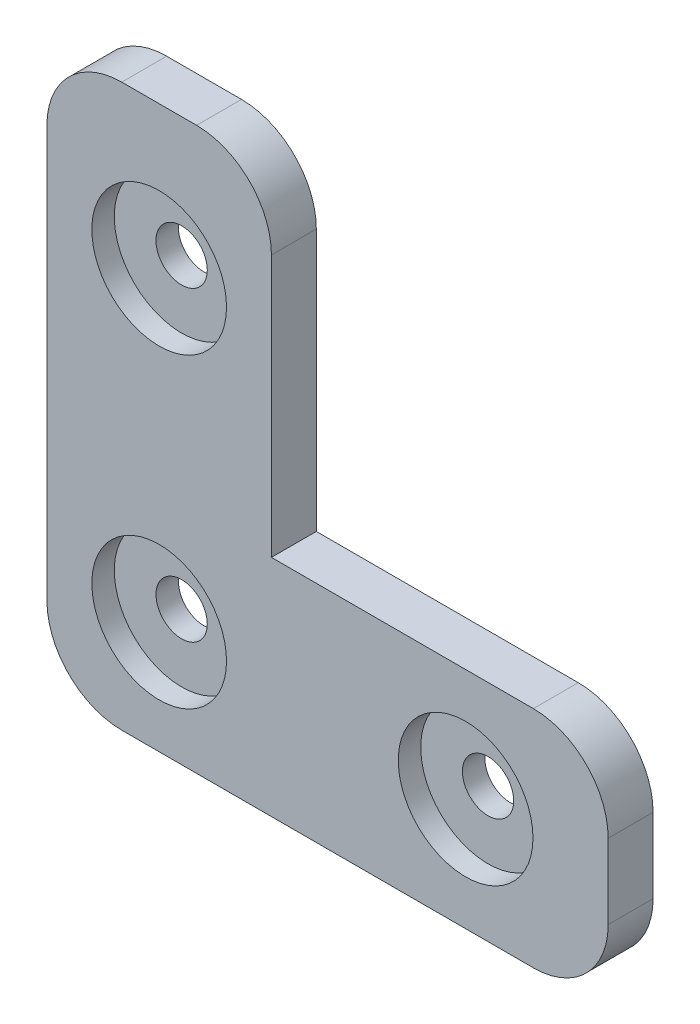
ISO-10303-21;
HEADER;
FILE_DESCRIPTION(('STEP AP214'),'2;1');
FILE_NAME('part.step','',(''),(''),'','','');
FILE_SCHEMA(('AUTOMOTIVE_DESIGN { 1 0 10303 214 1 1 1 1 }'));
ENDSEC;
DATA;
#1=APPLICATION_CONTEXT('core data for automotive mechanical design processes');
#2=APPLICATION_PROTOCOL_DEFINITION('international standard','automotive_design',2000,#1);
#3=PRODUCT_CONTEXT('',#1,'mechanical');
#4=PRODUCT('Part','Part','',(#3));
#5=PRODUCT_RELATED_PRODUCT_CATEGORY('part','',(#4));
#6=PRODUCT_DEFINITION_FORMATION('','',#4);
#7=PRODUCT_DEFINITION_CONTEXT('part definition',#1,'design');
#8=PRODUCT_DEFINITION('design','',#6,#7);
#9=PRODUCT_DEFINITION_SHAPE('','',#8);
#10=(LENGTH_UNIT() NAMED_UNIT(*) SI_UNIT(.MILLI.,.METRE.));
#11=(NAMED_UNIT(*) PLANE_ANGLE_UNIT() SI_UNIT($,.RADIAN.));
#12=(NAMED_UNIT(*) SI_UNIT($,.STERADIAN.) SOLID_ANGLE_UNIT());
#13=UNCERTAINTY_MEASURE_WITH_UNIT(LENGTH_MEASURE(1.E-05),#10,'distance_accuracy_value','');
#14=(GEOMETRIC_REPRESENTATION_CONTEXT(3) GLOBAL_UNCERTAINTY_ASSIGNED_CONTEXT((#13)) GLOBAL_UNIT_ASSIGNED_CONTEXT((#10,
#11,#12)) REPRESENTATION_CONTEXT('',''));
#15=CARTESIAN_POINT('',(0.,0.,0.));
#16=DIRECTION('',(0.,0.,1.));
#17=DIRECTION('',(1.,0.,0.));
#18=AXIS2_PLACEMENT_3D('',#15,#16,#17);
#19=CARTESIAN_POINT('',(15.,15.,0.));
#20=DIRECTION('',(0.,0.,1.));
#21=DIRECTION('',(1.,0.,0.));
#22=AXIS2_PLACEMENT_3D('',#19,#20,#21);
#23=CYLINDRICAL_SURFACE('',#22,3.429);
#24=CARTESIAN_POINT('',(15.,15.,0.));
#25=DIRECTION('',(0.,0.,1.));
#26=DIRECTION('',(1.,0.,0.));
#27=AXIS2_PLACEMENT_3D('',#24,#25,#26);
#28=CIRCLE('',#27,3.429);
#29=CARTESIAN_POINT('',(18.429,15.,0.));
#30=VERTEX_POINT('',#29);
#31=EDGE_CURVE('E154',#30,#30,#28,.T.);
#32=ORIENTED_EDGE('',*,*,#31,.F.);
#33=EDGE_LOOP('',(#32));
#34=FACE_BOUND('',#33,.T.);
#35=CARTESIAN_POINT('',(15.,15.,3.));
#36=DIRECTION('',(0.,0.,1.));
#37=DIRECTION('',(1.,0.,0.));
#38=AXIS2_PLACEMENT_3D('',#35,#36,#37);
#39=CIRCLE('',#38,3.429);
#40=CARTESIAN_POINT('',(18.429,15.,3.));
#41=VERTEX_POINT('',#40);
#42=EDGE_CURVE('E173',#41,#41,#39,.F.);
#43=ORIENTED_EDGE('',*,*,#42,.F.);
#44=EDGE_LOOP('',(#43));
#45=FACE_BOUND('',#44,.T.);
#46=ADVANCED_FACE('F33',(#34,#45),#23,.F.);
#47=CARTESIAN_POINT('',(15.,55.95,0.));
#48=DIRECTION('',(0.,0.,1.));
#49=DIRECTION('',(1.,0.,0.));
#50=AXIS2_PLACEMENT_3D('',#47,#48,#49);
#51=CYLINDRICAL_SURFACE('',#50,3.42900000000002);
#52=CARTESIAN_POINT('',(15.,55.95,0.));
#53=DIRECTION('',(0.,0.,1.));
#54=DIRECTION('',(1.,0.,0.));
#55=AXIS2_PLACEMENT_3D('',#52,#53,#54);
#56=CIRCLE('',#55,3.42900000000002);
#57=CARTESIAN_POINT('',(18.429,55.95,0.));
#58=VERTEX_POINT('',#57);
#59=EDGE_CURVE('E229',#58,#58,#56,.T.);
#60=ORIENTED_EDGE('',*,*,#59,.F.);
#61=EDGE_LOOP('',(#60));
#62=FACE_BOUND('',#61,.T.);
#63=CARTESIAN_POINT('',(15.,55.95,3.));
#64=DIRECTION('',(0.,0.,1.));
#65=DIRECTION('',(1.,0.,0.));
#66=AXIS2_PLACEMENT_3D('',#63,#64,#65);
#67=CIRCLE('',#66,3.42900000000002);
#68=CARTESIAN_POINT('',(18.429,55.95,3.));
#69=VERTEX_POINT('',#68);
#70=EDGE_CURVE('E169',#69,#69,#67,.F.);
#71=ORIENTED_EDGE('',*,*,#70,.F.);
#72=EDGE_LOOP('',(#71));
#73=FACE_BOUND('',#72,.T.);
#74=ADVANCED_FACE('F287',(#62,#73),#51,.F.);
#75=CARTESIAN_POINT('',(55.95,15.,0.));
#76=DIRECTION('',(0.,0.,1.));
#77=DIRECTION('',(1.,0.,0.));
#78=AXIS2_PLACEMENT_3D('',#75,#76,#77);
#79=CYLINDRICAL_SURFACE('',#78,3.429);
#80=CARTESIAN_POINT('',(55.95,15.,0.));
#81=DIRECTION('',(0.,0.,1.));
#82=DIRECTION('',(1.,0.,0.));
#83=AXIS2_PLACEMENT_3D('',#80,#81,#82);
#84=CIRCLE('',#83,3.429);
#85=CARTESIAN_POINT('',(59.379,15.,0.));
#86=VERTEX_POINT('',#85);
#87=EDGE_CURVE('E176',#86,#86,#84,.T.);
#88=ORIENTED_EDGE('',*,*,#87,.F.);
#89=EDGE_LOOP('',(#88));
#90=FACE_BOUND('',#89,.T.);
#91=CARTESIAN_POINT('',(55.95,15.,3.));
#92=DIRECTION('',(0.,0.,1.));
#93=DIRECTION('',(1.,0.,0.));
#94=AXIS2_PLACEMENT_3D('',#91,#92,#93);
#95=CIRCLE('',#94,3.429);
#96=CARTESIAN_POINT('',(59.379,15.,3.));
#97=VERTEX_POINT('',#96);
#98=EDGE_CURVE('E166',#97,#97,#95,.F.);
#99=ORIENTED_EDGE('',*,*,#98,.F.);
#100=EDGE_LOOP('',(#99));
#101=FACE_BOUND('',#100,.T.);
#102=ADVANCED_FACE('F293',(#90,#101),#79,.F.);
#103=CARTESIAN_POINT('',(75.,0.,6.));
#104=DIRECTION('',(0.,1.,0.));
#105=DIRECTION('',(-1.,0.,0.));
#106=AXIS2_PLACEMENT_3D('',#103,#104,#105);
#107=PLANE('',#106);
#108=DIRECTION('',(1.,0.,0.));
#109=VECTOR('',#108,1.);
#110=CARTESIAN_POINT('',(75.,0.,6.));
#111=LINE('',#110,#109);
#112=CARTESIAN_POINT('',(9.99999999999999,0.,6.));
#113=VERTEX_POINT('',#112);
#114=CARTESIAN_POINT('',(65.,0.,6.));
#115=VERTEX_POINT('',#114);
#116=EDGE_CURVE('E164',#113,#115,#111,.T.);
#117=ORIENTED_EDGE('',*,*,#116,.F.);
#118=DIRECTION('',(0.,0.,-1.));
#119=VECTOR('',#118,1.);
#120=CARTESIAN_POINT('',(9.99999999999999,0.,6.));
#121=LINE('',#120,#119);
#122=CARTESIAN_POINT('',(9.99999999999999,0.,0.));
#123=VERTEX_POINT('',#122);
#124=EDGE_CURVE('E206',#113,#123,#121,.T.);
#125=ORIENTED_EDGE('',*,*,#124,.T.);
#126=DIRECTION('',(1.,0.,0.));
#127=VECTOR('',#126,1.);
#128=CARTESIAN_POINT('',(75.,0.,0.));
#129=LINE('',#128,#127);
#130=CARTESIAN_POINT('',(65.,0.,0.));
#131=VERTEX_POINT('',#130);
#132=EDGE_CURVE('E150',#123,#131,#129,.T.);
#133=ORIENTED_EDGE('',*,*,#132,.T.);
#134=DIRECTION('',(0.,0.,-1.));
#135=VECTOR('',#134,1.);
#136=CARTESIAN_POINT('',(65.,0.,6.));
#137=LINE('',#136,#135);
#138=EDGE_CURVE('E204',#131,#115,#137,.F.);
#139=ORIENTED_EDGE('',*,*,#138,.T.);
#140=EDGE_LOOP('',(#117,#125,#133,#139));
#141=FACE_BOUND('',#140,.T.);
#142=ADVANCED_FACE('F314',(#141),#107,.F.);
#143=CARTESIAN_POINT('',(75.,30.,6.));
#144=DIRECTION('',(-1.,0.,0.));
#145=DIRECTION('',(0.,0.,1.));
#146=AXIS2_PLACEMENT_3D('',#143,#144,#145);
#147=PLANE('',#146);
#148=DIRECTION('',(0.,1.,0.));
#149=VECTOR('',#148,1.);
#150=CARTESIAN_POINT('',(75.,30.,6.));
#151=LINE('',#150,#149);
#152=CARTESIAN_POINT('',(75.,10.,6.));
#153=VERTEX_POINT('',#152);
#154=CARTESIAN_POINT('',(75.,20.,6.));
#155=VERTEX_POINT('',#154);
#156=EDGE_CURVE('E128',#153,#155,#151,.T.);
#157=ORIENTED_EDGE('',*,*,#156,.F.);
#158=DIRECTION('',(0.,0.,-1.));
#159=VECTOR('',#158,1.);
#160=CARTESIAN_POINT('',(75.,9.99999999999999,6.));
#161=LINE('',#160,#159);
#162=CARTESIAN_POINT('',(75.,10.,0.));
#163=VERTEX_POINT('',#162);
#164=EDGE_CURVE('E41',#153,#163,#161,.T.);
#165=ORIENTED_EDGE('',*,*,#164,.T.);
#166=DIRECTION('',(0.,1.,0.));
#167=VECTOR('',#166,1.);
#168=CARTESIAN_POINT('',(75.,30.,0.));
#169=LINE('',#168,#167);
#170=CARTESIAN_POINT('',(75.,20.,0.));
#171=VERTEX_POINT('',#170);
#172=EDGE_CURVE('E153',#163,#171,#169,.T.);
#173=ORIENTED_EDGE('',*,*,#172,.T.);
#174=DIRECTION('',(0.,0.,-1.));
#175=VECTOR('',#174,1.);
#176=CARTESIAN_POINT('',(75.,20.,6.));
#177=LINE('',#176,#175);
#178=EDGE_CURVE('E209',#171,#155,#177,.F.);
#179=ORIENTED_EDGE('',*,*,#178,.T.);
#180=EDGE_LOOP('',(#157,#165,#173,#179));
#181=FACE_BOUND('',#180,.T.);
#182=ADVANCED_FACE('F215',(#181),#147,.F.);
#183=CARTESIAN_POINT('',(30.,30.,6.));
#184=DIRECTION('',(0.,-1.,0.));
#185=DIRECTION('',(0.,0.,-1.));
#186=AXIS2_PLACEMENT_3D('',#183,#184,#185);
#187=PLANE('',#186);
#188=DIRECTION('',(-1.,0.,0.));
#189=VECTOR('',#188,1.);
#190=CARTESIAN_POINT('',(30.,30.,6.));
#191=LINE('',#190,#189);
#192=CARTESIAN_POINT('',(65.,30.,6.));
#193=VERTEX_POINT('',#192);
#194=CARTESIAN_POINT('',(30.,30.,6.));
#195=VERTEX_POINT('',#194);
#196=EDGE_CURVE('E117',#193,#195,#191,.T.);
#197=ORIENTED_EDGE('',*,*,#196,.F.);
#198=DIRECTION('',(0.,0.,-1.));
#199=VECTOR('',#198,1.);
#200=CARTESIAN_POINT('',(65.,30.,6.));
#201=LINE('',#200,#199);
#202=CARTESIAN_POINT('',(65.,30.,0.));
#203=VERTEX_POINT('',#202);
#204=EDGE_CURVE('E11',#193,#203,#201,.T.);
#205=ORIENTED_EDGE('',*,*,#204,.T.);
#206=DIRECTION('',(-1.,0.,0.));
#207=VECTOR('',#206,1.);
#208=CARTESIAN_POINT('',(30.,30.,0.));
#209=LINE('',#208,#207);
#210=CARTESIAN_POINT('',(30.,30.,0.));
#211=VERTEX_POINT('',#210);
#212=EDGE_CURVE('E134',#203,#211,#209,.T.);
#213=ORIENTED_EDGE('',*,*,#212,.T.);
#214=DIRECTION('',(0.,0.,-1.));
#215=VECTOR('',#214,1.);
#216=CARTESIAN_POINT('',(30.,30.,6.));
#217=LINE('',#216,#215);
#218=EDGE_CURVE('E131',#195,#211,#217,.T.);
#219=ORIENTED_EDGE('',*,*,#218,.F.);
#220=EDGE_LOOP('',(#197,#205,#213,#219));
#221=FACE_BOUND('',#220,.T.);
#222=ADVANCED_FACE('F132',(#221),#187,.F.);
#223=CARTESIAN_POINT('',(30.,75.,6.));
#224=DIRECTION('',(-1.,0.,0.));
#225=DIRECTION('',(0.,-1.,0.));
#226=AXIS2_PLACEMENT_3D('',#223,#224,#225);
#227=PLANE('',#226);
#228=DIRECTION('',(0.,1.,0.));
#229=VECTOR('',#228,1.);
#230=CARTESIAN_POINT('',(30.,75.,0.));
#231=LINE('',#230,#229);
#232=CARTESIAN_POINT('',(30.,65.,0.));
#233=VERTEX_POINT('',#232);
#234=EDGE_CURVE('E158',#211,#233,#231,.T.);
#235=ORIENTED_EDGE('',*,*,#234,.T.);
#236=DIRECTION('',(0.,0.,-1.));
#237=VECTOR('',#236,1.);
#238=CARTESIAN_POINT('',(30.,65.,6.));
#239=LINE('',#238,#237);
#240=CARTESIAN_POINT('',(30.,65.,6.));
#241=VERTEX_POINT('',#240);
#242=EDGE_CURVE('E143',#233,#241,#239,.F.);
#243=ORIENTED_EDGE('',*,*,#242,.T.);
#244=DIRECTION('',(0.,1.,0.));
#245=VECTOR('',#244,1.);
#246=CARTESIAN_POINT('',(30.,75.,6.));
#247=LINE('',#246,#245);
#248=EDGE_CURVE('E121',#195,#241,#247,.T.);
#249=ORIENTED_EDGE('',*,*,#248,.F.);
#250=ORIENTED_EDGE('',*,*,#218,.T.);
#251=EDGE_LOOP('',(#235,#243,#249,#250));
#252=FACE_BOUND('',#251,.T.);
#253=ADVANCED_FACE('F141',(#252),#227,.F.);
#254=CARTESIAN_POINT('',(0.,75.,6.));
#255=DIRECTION('',(0.,-1.,0.));
#256=DIRECTION('',(0.,0.,-1.));
#257=AXIS2_PLACEMENT_3D('',#254,#255,#256);
#258=PLANE('',#257);
#259=DIRECTION('',(-1.,0.,0.));
#260=VECTOR('',#259,1.);
#261=CARTESIAN_POINT('',(0.,75.,6.));
#262=LINE('',#261,#260);
#263=CARTESIAN_POINT('',(20.,75.,6.));
#264=VERTEX_POINT('',#263);
#265=CARTESIAN_POINT('',(10.,75.,6.));
#266=VERTEX_POINT('',#265);
#267=EDGE_CURVE('E144',#264,#266,#262,.T.);
#268=ORIENTED_EDGE('',*,*,#267,.F.);
#269=DIRECTION('',(0.,0.,-1.));
#270=VECTOR('',#269,1.);
#271=CARTESIAN_POINT('',(20.,75.,6.));
#272=LINE('',#271,#270);
#273=CARTESIAN_POINT('',(20.,75.,0.));
#274=VERTEX_POINT('',#273);
#275=EDGE_CURVE('E178',#264,#274,#272,.T.);
#276=ORIENTED_EDGE('',*,*,#275,.T.);
#277=DIRECTION('',(-1.,0.,0.));
#278=VECTOR('',#277,1.);
#279=CARTESIAN_POINT('',(0.,75.,0.));
#280=LINE('',#279,#278);
#281=CARTESIAN_POINT('',(10.,75.,0.));
#282=VERTEX_POINT('',#281);
#283=EDGE_CURVE('E160',#274,#282,#280,.T.);
#284=ORIENTED_EDGE('',*,*,#283,.T.);
#285=DIRECTION('',(0.,0.,-1.));
#286=VECTOR('',#285,1.);
#287=CARTESIAN_POINT('',(10.,75.,6.));
#288=LINE('',#287,#286);
#289=EDGE_CURVE('E138',#282,#266,#288,.F.);
#290=ORIENTED_EDGE('',*,*,#289,.T.);
#291=EDGE_LOOP('',(#268,#276,#284,#290));
#292=FACE_BOUND('',#291,.T.);
#293=ADVANCED_FACE('F304',(#292),#258,.F.);
#294=CARTESIAN_POINT('',(0.,0.,6.));
#295=DIRECTION('',(1.,0.,0.));
#296=DIRECTION('',(0.,0.,-1.));
#297=AXIS2_PLACEMENT_3D('',#294,#295,#296);
#298=PLANE('',#297);
#299=DIRECTION('',(0.,-1.,0.));
#300=VECTOR('',#299,1.);
#301=CARTESIAN_POINT('',(0.,0.,6.));
#302=LINE('',#301,#300);
#303=CARTESIAN_POINT('',(0.,65.,6.));
#304=VERTEX_POINT('',#303);
#305=CARTESIAN_POINT('',(0.,10.,6.));
#306=VERTEX_POINT('',#305);
#307=EDGE_CURVE('E139',#304,#306,#302,.T.);
#308=ORIENTED_EDGE('',*,*,#307,.F.);
#309=DIRECTION('',(0.,0.,-1.));
#310=VECTOR('',#309,1.);
#311=CARTESIAN_POINT('',(0.,65.,6.));
#312=LINE('',#311,#310);
#313=CARTESIAN_POINT('',(0.,65.,0.));
#314=VERTEX_POINT('',#313);
#315=EDGE_CURVE('E201',#304,#314,#312,.T.);
#316=ORIENTED_EDGE('',*,*,#315,.T.);
#317=DIRECTION('',(0.,-1.,0.));
#318=VECTOR('',#317,1.);
#319=CARTESIAN_POINT('',(0.,0.,0.));
#320=LINE('',#319,#318);
#321=CARTESIAN_POINT('',(0.,10.,0.));
#322=VERTEX_POINT('',#321);
#323=EDGE_CURVE('E163',#314,#322,#320,.T.);
#324=ORIENTED_EDGE('',*,*,#323,.T.);
#325=DIRECTION('',(0.,0.,-1.));
#326=VECTOR('',#325,1.);
#327=CARTESIAN_POINT('',(0.,10.,6.));
#328=LINE('',#327,#326);
#329=EDGE_CURVE('E48',#322,#306,#328,.F.);
#330=ORIENTED_EDGE('',*,*,#329,.T.);
#331=EDGE_LOOP('',(#308,#316,#324,#330));
#332=FACE_BOUND('',#331,.T.);
#333=ADVANCED_FACE('F264',(#332),#298,.F.);
#334=CARTESIAN_POINT('',(0.,0.,6.));
#335=DIRECTION('',(0.,0.,-1.));
#336=DIRECTION('',(-1.,0.,0.));
#337=AXIS2_PLACEMENT_3D('',#334,#335,#336);
#338=PLANE('',#337);
#339=CARTESIAN_POINT('',(55.95,15.,6.));
#340=DIRECTION('',(0.,0.,1.));
#341=DIRECTION('',(1.,0.,0.));
#342=AXIS2_PLACEMENT_3D('',#339,#340,#341);
#343=CIRCLE('',#342,9.);
#344=CARTESIAN_POINT('',(64.95,15.,6.));
#345=VERTEX_POINT('',#344);
#346=EDGE_CURVE('E246',#345,#345,#343,.T.);
#347=ORIENTED_EDGE('',*,*,#346,.F.);
#348=EDGE_LOOP('',(#347));
#349=FACE_BOUND('',#348,.T.);
#350=CARTESIAN_POINT('',(15.,15.,6.));
#351=DIRECTION('',(0.,0.,1.));
#352=DIRECTION('',(1.,0.,0.));
#353=AXIS2_PLACEMENT_3D('',#350,#351,#352);
#354=CIRCLE('',#353,9.);
#355=CARTESIAN_POINT('',(24.,15.,6.));
#356=VERTEX_POINT('',#355);
#357=EDGE_CURVE('E240',#356,#356,#354,.T.);
#358=ORIENTED_EDGE('',*,*,#357,.F.);
#359=EDGE_LOOP('',(#358));
#360=FACE_BOUND('',#359,.T.);
#361=CARTESIAN_POINT('',(15.,55.95,6.));
#362=DIRECTION('',(0.,0.,1.));
#363=DIRECTION('',(1.,0.,0.));
#364=AXIS2_PLACEMENT_3D('',#361,#362,#363);
#365=CIRCLE('',#364,9.);
#366=CARTESIAN_POINT('',(24.,55.95,6.));
#367=VERTEX_POINT('',#366);
#368=EDGE_CURVE('E234',#367,#367,#365,.T.);
#369=ORIENTED_EDGE('',*,*,#368,.F.);
#370=EDGE_LOOP('',(#369));
#371=FACE_BOUND('',#370,.T.);
#372=ORIENTED_EDGE('',*,*,#248,.T.);
#373=CARTESIAN_POINT('',(20.,65.,6.));
#374=DIRECTION('',(0.,0.,-1.));
#375=DIRECTION('',(-1.,0.,0.));
#376=AXIS2_PLACEMENT_3D('',#373,#374,#375);
#377=CIRCLE('',#376,10.);
#378=EDGE_CURVE('E198',#241,#264,#377,.F.);
#379=ORIENTED_EDGE('',*,*,#378,.T.);
#380=ORIENTED_EDGE('',*,*,#267,.T.);
#381=CARTESIAN_POINT('',(10.,65.,6.));
#382=DIRECTION('',(0.,0.,-1.));
#383=DIRECTION('',(-1.,0.,0.));
#384=AXIS2_PLACEMENT_3D('',#381,#382,#383);
#385=CIRCLE('',#384,10.);
#386=EDGE_CURVE('E55',#266,#304,#385,.F.);
#387=ORIENTED_EDGE('',*,*,#386,.T.);
#388=ORIENTED_EDGE('',*,*,#307,.T.);
#389=CARTESIAN_POINT('',(9.99999999999999,10.,6.));
#390=DIRECTION('',(0.,0.,-1.));
#391=DIRECTION('',(-1.,0.,0.));
#392=AXIS2_PLACEMENT_3D('',#389,#390,#391);
#393=CIRCLE('',#392,10.);
#394=EDGE_CURVE('E195',#306,#113,#393,.F.);
#395=ORIENTED_EDGE('',*,*,#394,.T.);
#396=ORIENTED_EDGE('',*,*,#116,.T.);
#397=CARTESIAN_POINT('',(65.,9.99999999999999,6.));
#398=DIRECTION('',(0.,0.,-1.));
#399=DIRECTION('',(-1.,0.,0.));
#400=AXIS2_PLACEMENT_3D('',#397,#398,#399);
#401=CIRCLE('',#400,10.);
#402=EDGE_CURVE('E193',#115,#153,#401,.F.);
#403=ORIENTED_EDGE('',*,*,#402,.T.);
#404=ORIENTED_EDGE('',*,*,#156,.T.);
#405=CARTESIAN_POINT('',(65.,20.,6.));
#406=DIRECTION('',(0.,0.,-1.));
#407=DIRECTION('',(-1.,0.,0.));
#408=AXIS2_PLACEMENT_3D('',#405,#406,#407);
#409=CIRCLE('',#408,10.);
#410=EDGE_CURVE('E125',#155,#193,#409,.F.);
#411=ORIENTED_EDGE('',*,*,#410,.T.);
#412=ORIENTED_EDGE('',*,*,#196,.T.);
#413=EDGE_LOOP('',(#372,#379,#380,#387,#388,#395,#396,#403,#404,#411,#412));
#414=FACE_BOUND('',#413,.T.);
#415=ADVANCED_FACE('F119',(#349,#360,#371,#414),#338,.F.);
#416=CARTESIAN_POINT('',(0.,0.,0.));
#417=DIRECTION('',(0.,0.,-1.));
#418=DIRECTION('',(-1.,0.,0.));
#419=AXIS2_PLACEMENT_3D('',#416,#417,#418);
#420=PLANE('',#419);
#421=ORIENTED_EDGE('',*,*,#87,.T.);
#422=EDGE_LOOP('',(#421));
#423=FACE_BOUND('',#422,.T.);
#424=ORIENTED_EDGE('',*,*,#59,.T.);
#425=EDGE_LOOP('',(#424));
#426=FACE_BOUND('',#425,.T.);
#427=ORIENTED_EDGE('',*,*,#31,.T.);
#428=EDGE_LOOP('',(#427));
#429=FACE_BOUND('',#428,.T.);
#430=ORIENTED_EDGE('',*,*,#283,.F.);
#431=CARTESIAN_POINT('',(20.,65.,0.));
#432=DIRECTION('',(0.,0.,-1.));
#433=DIRECTION('',(-1.,0.,0.));
#434=AXIS2_PLACEMENT_3D('',#431,#432,#433);
#435=CIRCLE('',#434,10.);
#436=EDGE_CURVE('E189',#274,#233,#435,.T.);
#437=ORIENTED_EDGE('',*,*,#436,.T.);
#438=ORIENTED_EDGE('',*,*,#234,.F.);
#439=ORIENTED_EDGE('',*,*,#212,.F.);
#440=CARTESIAN_POINT('',(65.,20.,0.));
#441=DIRECTION('',(0.,0.,-1.));
#442=DIRECTION('',(-1.,0.,0.));
#443=AXIS2_PLACEMENT_3D('',#440,#441,#442);
#444=CIRCLE('',#443,10.);
#445=EDGE_CURVE('E181',#203,#171,#444,.T.);
#446=ORIENTED_EDGE('',*,*,#445,.T.);
#447=ORIENTED_EDGE('',*,*,#172,.F.);
#448=CARTESIAN_POINT('',(65.,9.99999999999999,0.));
#449=DIRECTION('',(0.,0.,-1.));
#450=DIRECTION('',(-1.,0.,0.));
#451=AXIS2_PLACEMENT_3D('',#448,#449,#450);
#452=CIRCLE('',#451,10.);
#453=EDGE_CURVE('E183',#163,#131,#452,.T.);
#454=ORIENTED_EDGE('',*,*,#453,.T.);
#455=ORIENTED_EDGE('',*,*,#132,.F.);
#456=CARTESIAN_POINT('',(9.99999999999999,10.,0.));
#457=DIRECTION('',(0.,0.,-1.));
#458=DIRECTION('',(-1.,0.,0.));
#459=AXIS2_PLACEMENT_3D('',#456,#457,#458);
#460=CIRCLE('',#459,10.);
#461=EDGE_CURVE('E185',#123,#322,#460,.T.);
#462=ORIENTED_EDGE('',*,*,#461,.T.);
#463=ORIENTED_EDGE('',*,*,#323,.F.);
#464=CARTESIAN_POINT('',(10.,65.,0.));
#465=DIRECTION('',(0.,0.,-1.));
#466=DIRECTION('',(-1.,0.,0.));
#467=AXIS2_PLACEMENT_3D('',#464,#465,#466);
#468=CIRCLE('',#467,10.);
#469=EDGE_CURVE('E187',#314,#282,#468,.T.);
#470=ORIENTED_EDGE('',*,*,#469,.T.);
#471=EDGE_LOOP('',(#430,#437,#438,#439,#446,#447,#454,#455,#462,#463,#470));
#472=FACE_BOUND('',#471,.T.);
#473=ADVANCED_FACE('F221',(#423,#426,#429,#472),#420,.T.);
#474=CARTESIAN_POINT('',(55.95,15.,3.));
#475=DIRECTION('',(0.,0.,1.));
#476=DIRECTION('',(1.,0.,0.));
#477=AXIS2_PLACEMENT_3D('',#474,#475,#476);
#478=PLANE('',#477);
#479=CARTESIAN_POINT('',(55.95,15.,3.));
#480=DIRECTION('',(0.,0.,1.));
#481=DIRECTION('',(1.,0.,0.));
#482=AXIS2_PLACEMENT_3D('',#479,#480,#481);
#483=CIRCLE('',#482,9.);
#484=CARTESIAN_POINT('',(64.95,15.,3.));
#485=VERTEX_POINT('',#484);
#486=EDGE_CURVE('E170',#485,#485,#483,.T.);
#487=ORIENTED_EDGE('',*,*,#486,.T.);
#488=EDGE_LOOP('',(#487));
#489=FACE_BOUND('',#488,.T.);
#490=ORIENTED_EDGE('',*,*,#98,.T.);
#491=EDGE_LOOP('',(#490));
#492=FACE_BOUND('',#491,.T.);
#493=ADVANCED_FACE('F252',(#489,#492),#478,.T.);
#494=CARTESIAN_POINT('',(55.95,15.,3.));
#495=DIRECTION('',(0.,0.,1.));
#496=DIRECTION('',(1.,0.,0.));
#497=AXIS2_PLACEMENT_3D('',#494,#495,#496);
#498=CYLINDRICAL_SURFACE('',#497,9.);
#499=ORIENTED_EDGE('',*,*,#486,.F.);
#500=EDGE_LOOP('',(#499));
#501=FACE_BOUND('',#500,.T.);
#502=ORIENTED_EDGE('',*,*,#346,.T.);
#503=EDGE_LOOP('',(#502));
#504=FACE_BOUND('',#503,.T.);
#505=ADVANCED_FACE('F255',(#501,#504),#498,.F.);
#506=CARTESIAN_POINT('',(15.,55.95,3.));
#507=DIRECTION('',(0.,0.,1.));
#508=DIRECTION('',(1.,0.,0.));
#509=AXIS2_PLACEMENT_3D('',#506,#507,#508);
#510=PLANE('',#509);
#511=CARTESIAN_POINT('',(15.,55.95,3.));
#512=DIRECTION('',(0.,0.,1.));
#513=DIRECTION('',(1.,0.,0.));
#514=AXIS2_PLACEMENT_3D('',#511,#512,#513);
#515=CIRCLE('',#514,9.);
#516=CARTESIAN_POINT('',(24.,55.95,3.));
#517=VERTEX_POINT('',#516);
#518=EDGE_CURVE('E237',#517,#517,#515,.T.);
#519=ORIENTED_EDGE('',*,*,#518,.T.);
#520=EDGE_LOOP('',(#519));
#521=FACE_BOUND('',#520,.T.);
#522=ORIENTED_EDGE('',*,*,#70,.T.);
#523=EDGE_LOOP('',(#522));
#524=FACE_BOUND('',#523,.T.);
#525=ADVANCED_FACE('F258',(#521,#524),#510,.T.);
#526=CARTESIAN_POINT('',(15.,55.95,3.));
#527=DIRECTION('',(0.,0.,1.));
#528=DIRECTION('',(1.,0.,0.));
#529=AXIS2_PLACEMENT_3D('',#526,#527,#528);
#530=CYLINDRICAL_SURFACE('',#529,9.);
#531=ORIENTED_EDGE('',*,*,#518,.F.);
#532=EDGE_LOOP('',(#531));
#533=FACE_BOUND('',#532,.T.);
#534=ORIENTED_EDGE('',*,*,#368,.T.);
#535=EDGE_LOOP('',(#534));
#536=FACE_BOUND('',#535,.T.);
#537=ADVANCED_FACE('F270',(#533,#536),#530,.F.);
#538=CARTESIAN_POINT('',(15.,15.,3.));
#539=DIRECTION('',(0.,0.,1.));
#540=DIRECTION('',(1.,0.,0.));
#541=AXIS2_PLACEMENT_3D('',#538,#539,#540);
#542=PLANE('',#541);
#543=CARTESIAN_POINT('',(15.,15.,3.));
#544=DIRECTION('',(0.,0.,1.));
#545=DIRECTION('',(1.,0.,0.));
#546=AXIS2_PLACEMENT_3D('',#543,#544,#545);
#547=CIRCLE('',#546,9.);
#548=CARTESIAN_POINT('',(24.,15.,3.));
#549=VERTEX_POINT('',#548);
#550=EDGE_CURVE('E243',#549,#549,#547,.T.);
#551=ORIENTED_EDGE('',*,*,#550,.T.);
#552=EDGE_LOOP('',(#551));
#553=FACE_BOUND('',#552,.T.);
#554=ORIENTED_EDGE('',*,*,#42,.T.);
#555=EDGE_LOOP('',(#554));
#556=FACE_BOUND('',#555,.T.);
#557=ADVANCED_FACE('F272',(#553,#556),#542,.T.);
#558=CARTESIAN_POINT('',(15.,15.,3.));
#559=DIRECTION('',(0.,0.,1.));
#560=DIRECTION('',(1.,0.,0.));
#561=AXIS2_PLACEMENT_3D('',#558,#559,#560);
#562=CYLINDRICAL_SURFACE('',#561,9.);
#563=ORIENTED_EDGE('',*,*,#550,.F.);
#564=EDGE_LOOP('',(#563));
#565=FACE_BOUND('',#564,.T.);
#566=ORIENTED_EDGE('',*,*,#357,.T.);
#567=EDGE_LOOP('',(#566));
#568=FACE_BOUND('',#567,.T.);
#569=ADVANCED_FACE('F279',(#565,#568),#562,.F.);
#570=CARTESIAN_POINT('',(20.,65.,6.));
#571=DIRECTION('',(0.,0.,-1.));
#572=DIRECTION('',(-1.,0.,0.));
#573=AXIS2_PLACEMENT_3D('',#570,#571,#572);
#574=CYLINDRICAL_SURFACE('',#573,10.);
#575=ORIENTED_EDGE('',*,*,#378,.F.);
#576=ORIENTED_EDGE('',*,*,#242,.F.);
#577=ORIENTED_EDGE('',*,*,#436,.F.);
#578=ORIENTED_EDGE('',*,*,#275,.F.);
#579=EDGE_LOOP('',(#575,#576,#577,#578));
#580=FACE_BOUND('',#579,.T.);
#581=ADVANCED_FACE('F318',(#580),#574,.T.);
#582=CARTESIAN_POINT('',(10.,65.,6.));
#583=DIRECTION('',(0.,0.,-1.));
#584=DIRECTION('',(-1.,0.,0.));
#585=AXIS2_PLACEMENT_3D('',#582,#583,#584);
#586=CYLINDRICAL_SURFACE('',#585,10.);
#587=ORIENTED_EDGE('',*,*,#386,.F.);
#588=ORIENTED_EDGE('',*,*,#289,.F.);
#589=ORIENTED_EDGE('',*,*,#469,.F.);
#590=ORIENTED_EDGE('',*,*,#315,.F.);
#591=EDGE_LOOP('',(#587,#588,#589,#590));
#592=FACE_BOUND('',#591,.T.);
#593=ADVANCED_FACE('F321',(#592),#586,.T.);
#594=CARTESIAN_POINT('',(9.99999999999999,10.,6.));
#595=DIRECTION('',(0.,0.,-1.));
#596=DIRECTION('',(-1.,0.,0.));
#597=AXIS2_PLACEMENT_3D('',#594,#595,#596);
#598=CYLINDRICAL_SURFACE('',#597,10.);
#599=ORIENTED_EDGE('',*,*,#394,.F.);
#600=ORIENTED_EDGE('',*,*,#329,.F.);
#601=ORIENTED_EDGE('',*,*,#461,.F.);
#602=ORIENTED_EDGE('',*,*,#124,.F.);
#603=EDGE_LOOP('',(#599,#600,#601,#602));
#604=FACE_BOUND('',#603,.T.);
#605=ADVANCED_FACE('F325',(#604),#598,.T.);
#606=CARTESIAN_POINT('',(65.,9.99999999999999,6.));
#607=DIRECTION('',(0.,0.,-1.));
#608=DIRECTION('',(-1.,0.,0.));
#609=AXIS2_PLACEMENT_3D('',#606,#607,#608);
#610=CYLINDRICAL_SURFACE('',#609,10.);
#611=ORIENTED_EDGE('',*,*,#402,.F.);
#612=ORIENTED_EDGE('',*,*,#138,.F.);
#613=ORIENTED_EDGE('',*,*,#453,.F.);
#614=ORIENTED_EDGE('',*,*,#164,.F.);
#615=EDGE_LOOP('',(#611,#612,#613,#614));
#616=FACE_BOUND('',#615,.T.);
#617=ADVANCED_FACE('F328',(#616),#610,.T.);
#618=CARTESIAN_POINT('',(65.,20.,6.));
#619=DIRECTION('',(0.,0.,-1.));
#620=DIRECTION('',(-1.,0.,0.));
#621=AXIS2_PLACEMENT_3D('',#618,#619,#620);
#622=CYLINDRICAL_SURFACE('',#621,10.);
#623=ORIENTED_EDGE('',*,*,#410,.F.);
#624=ORIENTED_EDGE('',*,*,#178,.F.);
#625=ORIENTED_EDGE('',*,*,#445,.F.);
#626=ORIENTED_EDGE('',*,*,#204,.F.);
#627=EDGE_LOOP('',(#623,#624,#625,#626));
#628=FACE_BOUND('',#627,.T.);
#629=ADVANCED_FACE('F35',(#628),#622,.T.);
#630=CLOSED_SHELL('',(#46,#74,#102,#142,#182,#222,#253,#293,#333,#415,#473,#493,#505,#525,#537,
#557,#569,#581,#593,#605,#617,#629));
#631=MANIFOLD_SOLID_BREP('B2',#630);
#632=ADVANCED_BREP_SHAPE_REPRESENTATION('',(#18,#631),#14);
#633=SHAPE_DEFINITION_REPRESENTATION(#9,#632);
ENDSEC;
END-ISO-10303-21;
